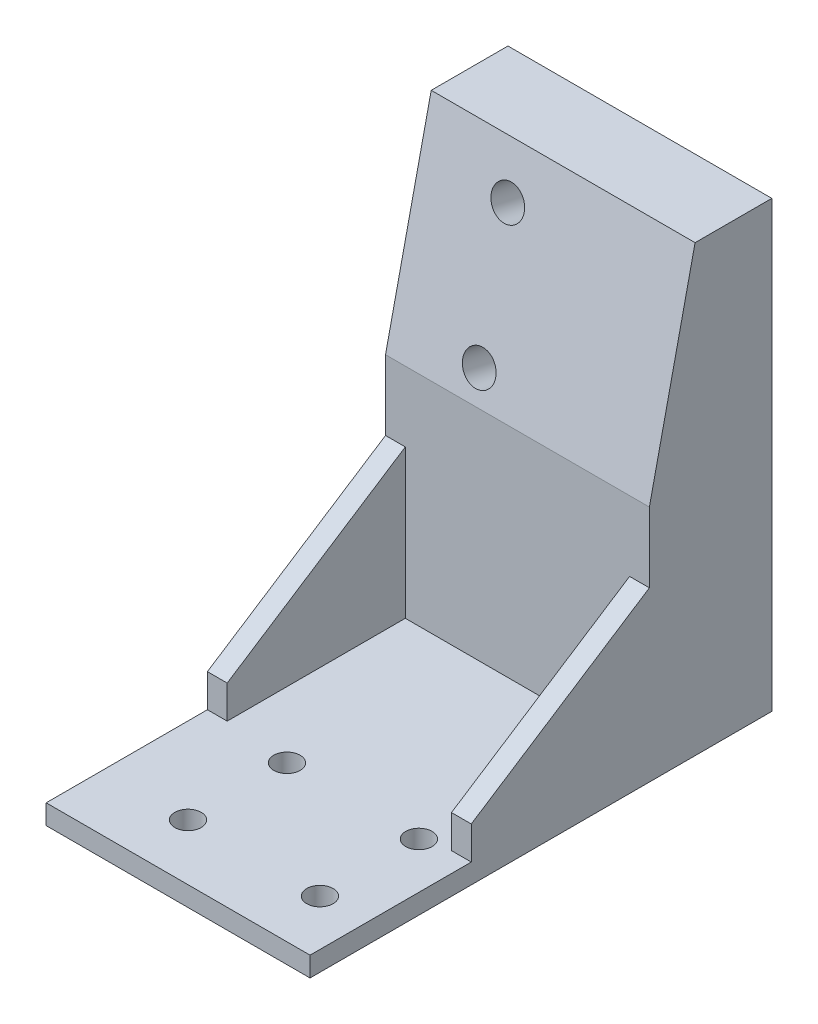
ISO-10303-21;
HEADER;
FILE_DESCRIPTION(('STEP AP214'),'2;1');
FILE_NAME('part.step','',(''),(''),'','','');
FILE_SCHEMA(('AUTOMOTIVE_DESIGN { 1 0 10303 214 1 1 1 1 }'));
ENDSEC;
DATA;
#1=APPLICATION_CONTEXT('core data for automotive mechanical design processes');
#2=APPLICATION_PROTOCOL_DEFINITION('international standard','automotive_design',2000,#1);
#3=PRODUCT_CONTEXT('',#1,'mechanical');
#4=PRODUCT('Part','Part','',(#3));
#5=PRODUCT_RELATED_PRODUCT_CATEGORY('part','',(#4));
#6=PRODUCT_DEFINITION_FORMATION('','',#4);
#7=PRODUCT_DEFINITION_CONTEXT('part definition',#1,'design');
#8=PRODUCT_DEFINITION('design','',#6,#7);
#9=PRODUCT_DEFINITION_SHAPE('','',#8);
#10=(LENGTH_UNIT() NAMED_UNIT(*) SI_UNIT(.MILLI.,.METRE.));
#11=(NAMED_UNIT(*) PLANE_ANGLE_UNIT() SI_UNIT($,.RADIAN.));
#12=(NAMED_UNIT(*) SI_UNIT($,.STERADIAN.) SOLID_ANGLE_UNIT());
#13=UNCERTAINTY_MEASURE_WITH_UNIT(LENGTH_MEASURE(1.E-05),#10,'distance_accuracy_value','');
#14=(GEOMETRIC_REPRESENTATION_CONTEXT(3) GLOBAL_UNCERTAINTY_ASSIGNED_CONTEXT((#13)) GLOBAL_UNIT_ASSIGNED_CONTEXT((#10,
#11,#12)) REPRESENTATION_CONTEXT('',''));
#15=CARTESIAN_POINT('',(0.,0.,0.));
#16=DIRECTION('',(0.,0.,1.));
#17=DIRECTION('',(1.,0.,0.));
#18=AXIS2_PLACEMENT_3D('',#15,#16,#17);
#19=CARTESIAN_POINT('',(0.,3.,0.));
#20=DIRECTION('',(0.,-1.,0.));
#21=DIRECTION('',(0.,0.,-1.));
#22=AXIS2_PLACEMENT_3D('',#19,#20,#21);
#23=PLANE('',#22);
#24=CARTESIAN_POINT('',(-7.,3.,11.5));
#25=DIRECTION('',(0.,1.,0.));
#26=DIRECTION('',(0.,0.,1.));
#27=AXIS2_PLACEMENT_3D('',#24,#25,#26);
#28=CIRCLE('',#27,2.);
#29=CARTESIAN_POINT('',(-7.,3.,13.5));
#30=VERTEX_POINT('',#29);
#31=EDGE_CURVE('E237',#30,#30,#28,.T.);
#32=ORIENTED_EDGE('',*,*,#31,.F.);
#33=EDGE_LOOP('',(#32));
#34=FACE_BOUND('',#33,.T.);
#35=CARTESIAN_POINT('',(13.,3.,26.5));
#36=DIRECTION('',(0.,1.,0.));
#37=DIRECTION('',(0.,0.,1.));
#38=AXIS2_PLACEMENT_3D('',#35,#36,#37);
#39=CIRCLE('',#38,2.);
#40=CARTESIAN_POINT('',(13.,3.,28.5));
#41=VERTEX_POINT('',#40);
#42=EDGE_CURVE('E230',#41,#41,#39,.T.);
#43=ORIENTED_EDGE('',*,*,#42,.F.);
#44=EDGE_LOOP('',(#43));
#45=FACE_BOUND('',#44,.T.);
#46=CARTESIAN_POINT('',(-7.,3.,26.5));
#47=DIRECTION('',(0.,1.,0.));
#48=DIRECTION('',(0.,0.,1.));
#49=AXIS2_PLACEMENT_3D('',#46,#47,#48);
#50=CIRCLE('',#49,2.);
#51=CARTESIAN_POINT('',(-7.,3.,28.5));
#52=VERTEX_POINT('',#51);
#53=EDGE_CURVE('E238',#52,#52,#50,.T.);
#54=ORIENTED_EDGE('',*,*,#53,.F.);
#55=EDGE_LOOP('',(#54));
#56=FACE_BOUND('',#55,.T.);
#57=CARTESIAN_POINT('',(13.,3.,11.5));
#58=DIRECTION('',(0.,1.,0.));
#59=DIRECTION('',(0.,0.,1.));
#60=AXIS2_PLACEMENT_3D('',#57,#58,#59);
#61=CIRCLE('',#60,2.);
#62=CARTESIAN_POINT('',(13.,3.,13.5));
#63=VERTEX_POINT('',#62);
#64=EDGE_CURVE('E232',#63,#63,#61,.T.);
#65=ORIENTED_EDGE('',*,*,#64,.F.);
#66=EDGE_LOOP('',(#65));
#67=FACE_BOUND('',#66,.T.);
#68=DIRECTION('',(0.,0.,-1.));
#69=VECTOR('',#68,1.);
#70=CARTESIAN_POINT('',(-17.,3.,10.56));
#71=LINE('',#70,#69);
#72=CARTESIAN_POINT('',(-17.,3.,10.56));
#73=VERTEX_POINT('',#72);
#74=CARTESIAN_POINT('',(-17.,3.,-16.44));
#75=VERTEX_POINT('',#74);
#76=EDGE_CURVE('E57',#73,#75,#71,.T.);
#77=ORIENTED_EDGE('',*,*,#76,.F.);
#78=DIRECTION('',(-1.,0.,0.));
#79=VECTOR('',#78,1.);
#80=CARTESIAN_POINT('',(-17.,3.,10.56));
#81=LINE('',#80,#79);
#82=CARTESIAN_POINT('',(-20.,3.,10.56));
#83=VERTEX_POINT('',#82);
#84=EDGE_CURVE('E141',#73,#83,#81,.T.);
#85=ORIENTED_EDGE('',*,*,#84,.T.);
#86=DIRECTION('',(0.,0.,1.));
#87=VECTOR('',#86,1.);
#88=CARTESIAN_POINT('',(-20.,3.,35.));
#89=LINE('',#88,#87);
#90=CARTESIAN_POINT('',(-20.,3.,35.));
#91=VERTEX_POINT('',#90);
#92=EDGE_CURVE('E255',#83,#91,#89,.T.);
#93=ORIENTED_EDGE('',*,*,#92,.T.);
#94=DIRECTION('',(1.,0.,0.));
#95=VECTOR('',#94,1.);
#96=CARTESIAN_POINT('',(-20.,3.,35.));
#97=LINE('',#96,#95);
#98=CARTESIAN_POINT('',(20.,3.,35.));
#99=VERTEX_POINT('',#98);
#100=EDGE_CURVE('E260',#91,#99,#97,.T.);
#101=ORIENTED_EDGE('',*,*,#100,.T.);
#102=DIRECTION('',(0.,0.,-1.));
#103=VECTOR('',#102,1.);
#104=CARTESIAN_POINT('',(20.,3.,35.));
#105=LINE('',#104,#103);
#106=CARTESIAN_POINT('',(20.,3.,10.56));
#107=VERTEX_POINT('',#106);
#108=EDGE_CURVE('E253',#99,#107,#105,.T.);
#109=ORIENTED_EDGE('',*,*,#108,.T.);
#110=DIRECTION('',(1.,0.,0.));
#111=VECTOR('',#110,1.);
#112=CARTESIAN_POINT('',(17.,3.,10.56));
#113=LINE('',#112,#111);
#114=CARTESIAN_POINT('',(17.,3.,10.56));
#115=VERTEX_POINT('',#114);
#116=EDGE_CURVE('E181',#115,#107,#113,.T.);
#117=ORIENTED_EDGE('',*,*,#116,.F.);
#118=DIRECTION('',(0.,0.,-1.));
#119=VECTOR('',#118,1.);
#120=CARTESIAN_POINT('',(17.,3.,10.56));
#121=LINE('',#120,#119);
#122=CARTESIAN_POINT('',(17.,3.,-16.44));
#123=VERTEX_POINT('',#122);
#124=EDGE_CURVE('E172',#115,#123,#121,.T.);
#125=ORIENTED_EDGE('',*,*,#124,.T.);
#126=DIRECTION('',(1.,0.,0.));
#127=VECTOR('',#126,1.);
#128=CARTESIAN_POINT('',(-86.9745143908501,3.,-16.44));
#129=LINE('',#128,#127);
#130=EDGE_CURVE('E206',#75,#123,#129,.T.);
#131=ORIENTED_EDGE('',*,*,#130,.F.);
#132=EDGE_LOOP('',(#77,#85,#93,#101,#109,#117,#125,#131));
#133=FACE_BOUND('',#132,.T.);
#134=ADVANCED_FACE('F41',(#34,#45,#56,#67,#133),#23,.F.);
#135=CARTESIAN_POINT('',(-86.9745143908501,3.,-16.44));
#136=DIRECTION('',(0.,0.,1.));
#137=DIRECTION('',(1.,0.,0.));
#138=AXIS2_PLACEMENT_3D('',#135,#136,#137);
#139=PLANE('',#138);
#140=DIRECTION('',(-1.,0.,0.));
#141=VECTOR('',#140,1.);
#142=CARTESIAN_POINT('',(-17.,25.5,-16.44));
#143=LINE('',#142,#141);
#144=CARTESIAN_POINT('',(-17.,25.5,-16.44));
#145=VERTEX_POINT('',#144);
#146=CARTESIAN_POINT('',(-20.,25.5,-16.44));
#147=VERTEX_POINT('',#146);
#148=EDGE_CURVE('E153',#145,#147,#143,.T.);
#149=ORIENTED_EDGE('',*,*,#148,.F.);
#150=DIRECTION('',(0.,1.,0.));
#151=VECTOR('',#150,1.);
#152=CARTESIAN_POINT('',(-17.,3.,-16.44));
#153=LINE('',#152,#151);
#154=EDGE_CURVE('E64',#75,#145,#153,.T.);
#155=ORIENTED_EDGE('',*,*,#154,.F.);
#156=ORIENTED_EDGE('',*,*,#130,.T.);
#157=DIRECTION('',(0.,1.,0.));
#158=VECTOR('',#157,1.);
#159=CARTESIAN_POINT('',(17.,3.,-16.44));
#160=LINE('',#159,#158);
#161=CARTESIAN_POINT('',(17.,25.5,-16.44));
#162=VERTEX_POINT('',#161);
#163=EDGE_CURVE('E167',#123,#162,#160,.T.);
#164=ORIENTED_EDGE('',*,*,#163,.T.);
#165=DIRECTION('',(1.,0.,0.));
#166=VECTOR('',#165,1.);
#167=CARTESIAN_POINT('',(17.,25.5,-16.44));
#168=LINE('',#167,#166);
#169=CARTESIAN_POINT('',(20.,25.5,-16.44));
#170=VERTEX_POINT('',#169);
#171=EDGE_CURVE('E177',#162,#170,#168,.T.);
#172=ORIENTED_EDGE('',*,*,#171,.T.);
#173=DIRECTION('',(0.,-1.,0.));
#174=VECTOR('',#173,1.);
#175=CARTESIAN_POINT('',(20.,3.,-16.44));
#176=LINE('',#175,#174);
#177=CARTESIAN_POINT('',(20.,36.11,-16.44));
#178=VERTEX_POINT('',#177);
#179=EDGE_CURVE('E216',#178,#170,#176,.T.);
#180=ORIENTED_EDGE('',*,*,#179,.F.);
#181=DIRECTION('',(1.,0.,0.));
#182=VECTOR('',#181,1.);
#183=CARTESIAN_POINT('',(-86.9745143908501,36.11,-16.44));
#184=LINE('',#183,#182);
#185=CARTESIAN_POINT('',(-20.,36.11,-16.44));
#186=VERTEX_POINT('',#185);
#187=EDGE_CURVE('E222',#186,#178,#184,.T.);
#188=ORIENTED_EDGE('',*,*,#187,.F.);
#189=DIRECTION('',(0.,1.,0.));
#190=VECTOR('',#189,1.);
#191=CARTESIAN_POINT('',(-20.,3.,-16.44));
#192=LINE('',#191,#190);
#193=EDGE_CURVE('E208',#147,#186,#192,.T.);
#194=ORIENTED_EDGE('',*,*,#193,.F.);
#195=EDGE_LOOP('',(#149,#155,#156,#164,#172,#180,#188,#194));
#196=FACE_BOUND('',#195,.T.);
#197=ADVANCED_FACE('F291',(#196),#139,.T.);
#198=CARTESIAN_POINT('',(20.,3.,35.));
#199=DIRECTION('',(-1.,0.,0.));
#200=DIRECTION('',(0.,0.,1.));
#201=AXIS2_PLACEMENT_3D('',#198,#199,#200);
#202=PLANE('',#201);
#203=DIRECTION('',(0.,0.,-1.));
#204=VECTOR('',#203,1.);
#205=CARTESIAN_POINT('',(20.,0.,35.));
#206=LINE('',#205,#204);
#207=CARTESIAN_POINT('',(20.,0.,35.));
#208=VERTEX_POINT('',#207);
#209=CARTESIAN_POINT('',(20.,0.,-35.));
#210=VERTEX_POINT('',#209);
#211=EDGE_CURVE('E247',#208,#210,#206,.T.);
#212=ORIENTED_EDGE('',*,*,#211,.T.);
#213=DIRECTION('',(0.,-1.,0.));
#214=VECTOR('',#213,1.);
#215=CARTESIAN_POINT('',(20.,3.,-35.));
#216=LINE('',#215,#214);
#217=CARTESIAN_POINT('',(20.,67.3514722278379,-35.));
#218=VERTEX_POINT('',#217);
#219=EDGE_CURVE('E11',#218,#210,#216,.T.);
#220=ORIENTED_EDGE('',*,*,#219,.F.);
#221=DIRECTION('',(0.,0.,1.));
#222=VECTOR('',#221,1.);
#223=CARTESIAN_POINT('',(20.,67.3514722278379,-23.3660676460193));
#224=LINE('',#223,#222);
#225=CARTESIAN_POINT('',(20.,67.3514722278379,-23.3660676460193));
#226=VERTEX_POINT('',#225);
#227=EDGE_CURVE('E203',#218,#226,#224,.T.);
#228=ORIENTED_EDGE('',*,*,#227,.T.);
#229=DIRECTION('',(0.,-0.976296007119933,0.216439613938103));
#230=VECTOR('',#229,1.);
#231=CARTESIAN_POINT('',(20.,36.11,-16.44));
#232=LINE('',#231,#230);
#233=EDGE_CURVE('E213',#226,#178,#232,.T.);
#234=ORIENTED_EDGE('',*,*,#233,.T.);
#235=ORIENTED_EDGE('',*,*,#179,.T.);
#236=DIRECTION('',(0.,-0.543895454249569,0.839152986556477));
#237=VECTOR('',#236,1.);
#238=CARTESIAN_POINT('',(20.,25.5,-16.44));
#239=LINE('',#238,#237);
#240=CARTESIAN_POINT('',(20.,8.,10.56));
#241=VERTEX_POINT('',#240);
#242=EDGE_CURVE('E162',#170,#241,#239,.T.);
#243=ORIENTED_EDGE('',*,*,#242,.T.);
#244=DIRECTION('',(0.,-1.,0.));
#245=VECTOR('',#244,1.);
#246=CARTESIAN_POINT('',(20.,8.,10.56));
#247=LINE('',#246,#245);
#248=EDGE_CURVE('E168',#241,#107,#247,.T.);
#249=ORIENTED_EDGE('',*,*,#248,.T.);
#250=ORIENTED_EDGE('',*,*,#108,.F.);
#251=DIRECTION('',(0.,-1.,0.));
#252=VECTOR('',#251,1.);
#253=CARTESIAN_POINT('',(20.,3.,35.));
#254=LINE('',#253,#252);
#255=EDGE_CURVE('E259',#99,#208,#254,.T.);
#256=ORIENTED_EDGE('',*,*,#255,.T.);
#257=EDGE_LOOP('',(#212,#220,#228,#234,#235,#243,#249,#250,#256));
#258=FACE_BOUND('',#257,.T.);
#259=ADVANCED_FACE('F43',(#258),#202,.F.);
#260=CARTESIAN_POINT('',(-20.,3.,-35.));
#261=DIRECTION('',(0.,0.,1.));
#262=DIRECTION('',(1.,0.,0.));
#263=AXIS2_PLACEMENT_3D('',#260,#261,#262);
#264=PLANE('',#263);
#265=CARTESIAN_POINT('',(-6.77,57.0901951620525,-35.));
#266=DIRECTION('',(0.,0.,1.));
#267=DIRECTION('',(0.,1.,0.));
#268=AXIS2_PLACEMENT_3D('',#265,#266,#267);
#269=ELLIPSE('',#268,2.56069878578627,2.5);
#270=CARTESIAN_POINT('',(-6.77,59.6508939478388,-35.));
#271=VERTEX_POINT('',#270);
#272=EDGE_CURVE('E196',#271,#271,#269,.T.);
#273=ORIENTED_EDGE('',*,*,#272,.T.);
#274=EDGE_LOOP('',(#273));
#275=FACE_BOUND('',#274,.T.);
#276=CARTESIAN_POINT('',(-6.77,36.6046048757623,-35.));
#277=DIRECTION('',(0.,0.,1.));
#278=DIRECTION('',(0.,1.,0.));
#279=AXIS2_PLACEMENT_3D('',#276,#277,#278);
#280=ELLIPSE('',#279,2.56069878578627,2.5);
#281=CARTESIAN_POINT('',(-6.77,39.1653036615486,-35.));
#282=VERTEX_POINT('',#281);
#283=EDGE_CURVE('E192',#282,#282,#280,.T.);
#284=ORIENTED_EDGE('',*,*,#283,.T.);
#285=EDGE_LOOP('',(#284));
#286=FACE_BOUND('',#285,.T.);
#287=DIRECTION('',(-1.,0.,0.));
#288=VECTOR('',#287,1.);
#289=CARTESIAN_POINT('',(-20.,0.,-35.));
#290=LINE('',#289,#288);
#291=CARTESIAN_POINT('',(-20.,0.,-35.));
#292=VERTEX_POINT('',#291);
#293=EDGE_CURVE('E265',#210,#292,#290,.T.);
#294=ORIENTED_EDGE('',*,*,#293,.T.);
#295=DIRECTION('',(0.,-1.,0.));
#296=VECTOR('',#295,1.);
#297=CARTESIAN_POINT('',(-20.,3.,-35.));
#298=LINE('',#297,#296);
#299=CARTESIAN_POINT('',(-20.,67.3514722278379,-35.));
#300=VERTEX_POINT('',#299);
#301=EDGE_CURVE('E47',#300,#292,#298,.T.);
#302=ORIENTED_EDGE('',*,*,#301,.F.);
#303=DIRECTION('',(1.,0.,0.));
#304=VECTOR('',#303,1.);
#305=CARTESIAN_POINT('',(-86.9745143908501,67.3514722278379,-35.));
#306=LINE('',#305,#304);
#307=EDGE_CURVE('E218',#300,#218,#306,.T.);
#308=ORIENTED_EDGE('',*,*,#307,.T.);
#309=ORIENTED_EDGE('',*,*,#219,.T.);
#310=EDGE_LOOP('',(#294,#302,#308,#309));
#311=FACE_BOUND('',#310,.T.);
#312=ADVANCED_FACE('F302',(#275,#286,#311),#264,.F.);
#313=CARTESIAN_POINT('',(-20.,3.,35.));
#314=DIRECTION('',(1.,0.,0.));
#315=DIRECTION('',(0.,0.,-1.));
#316=AXIS2_PLACEMENT_3D('',#313,#314,#315);
#317=PLANE('',#316);
#318=ORIENTED_EDGE('',*,*,#92,.F.);
#319=DIRECTION('',(0.,-1.,0.));
#320=VECTOR('',#319,1.);
#321=CARTESIAN_POINT('',(-20.,8.,10.56));
#322=LINE('',#321,#320);
#323=CARTESIAN_POINT('',(-20.,8.,10.56));
#324=VERTEX_POINT('',#323);
#325=EDGE_CURVE('E159',#324,#83,#322,.T.);
#326=ORIENTED_EDGE('',*,*,#325,.F.);
#327=DIRECTION('',(0.,-0.543895454249569,0.839152986556477));
#328=VECTOR('',#327,1.);
#329=CARTESIAN_POINT('',(-20.,25.5,-16.44));
#330=LINE('',#329,#328);
#331=EDGE_CURVE('E149',#147,#324,#330,.T.);
#332=ORIENTED_EDGE('',*,*,#331,.F.);
#333=ORIENTED_EDGE('',*,*,#193,.T.);
#334=DIRECTION('',(0.,0.976296007119933,-0.216439613938103));
#335=VECTOR('',#334,1.);
#336=CARTESIAN_POINT('',(-20.,36.11,-16.44));
#337=LINE('',#336,#335);
#338=CARTESIAN_POINT('',(-20.,67.3514722278379,-23.3660676460193));
#339=VERTEX_POINT('',#338);
#340=EDGE_CURVE('E202',#186,#339,#337,.T.);
#341=ORIENTED_EDGE('',*,*,#340,.T.);
#342=DIRECTION('',(0.,0.,-1.));
#343=VECTOR('',#342,1.);
#344=CARTESIAN_POINT('',(-20.,67.3514722278379,-23.3660676460193));
#345=LINE('',#344,#343);
#346=EDGE_CURVE('E205',#339,#300,#345,.T.);
#347=ORIENTED_EDGE('',*,*,#346,.T.);
#348=ORIENTED_EDGE('',*,*,#301,.T.);
#349=DIRECTION('',(0.,0.,1.));
#350=VECTOR('',#349,1.);
#351=CARTESIAN_POINT('',(-20.,0.,35.));
#352=LINE('',#351,#350);
#353=CARTESIAN_POINT('',(-20.,0.,35.));
#354=VERTEX_POINT('',#353);
#355=EDGE_CURVE('E262',#292,#354,#352,.T.);
#356=ORIENTED_EDGE('',*,*,#355,.T.);
#357=DIRECTION('',(0.,-1.,0.));
#358=VECTOR('',#357,1.);
#359=CARTESIAN_POINT('',(-20.,3.,35.));
#360=LINE('',#359,#358);
#361=EDGE_CURVE('E267',#91,#354,#360,.T.);
#362=ORIENTED_EDGE('',*,*,#361,.F.);
#363=EDGE_LOOP('',(#318,#326,#332,#333,#341,#347,#348,#356,#362));
#364=FACE_BOUND('',#363,.T.);
#365=ADVANCED_FACE('F274',(#364),#317,.F.);
#366=CARTESIAN_POINT('',(-20.,3.,35.));
#367=DIRECTION('',(0.,0.,-1.));
#368=DIRECTION('',(-1.,0.,0.));
#369=AXIS2_PLACEMENT_3D('',#366,#367,#368);
#370=PLANE('',#369);
#371=DIRECTION('',(1.,0.,0.));
#372=VECTOR('',#371,1.);
#373=CARTESIAN_POINT('',(-20.,0.,35.));
#374=LINE('',#373,#372);
#375=EDGE_CURVE('E254',#354,#208,#374,.T.);
#376=ORIENTED_EDGE('',*,*,#375,.T.);
#377=ORIENTED_EDGE('',*,*,#255,.F.);
#378=ORIENTED_EDGE('',*,*,#100,.F.);
#379=ORIENTED_EDGE('',*,*,#361,.T.);
#380=EDGE_LOOP('',(#376,#377,#378,#379));
#381=FACE_BOUND('',#380,.T.);
#382=ADVANCED_FACE('F288',(#381),#370,.F.);
#383=CARTESIAN_POINT('',(0.,0.,0.));
#384=DIRECTION('',(0.,-1.,0.));
#385=DIRECTION('',(0.,0.,-1.));
#386=AXIS2_PLACEMENT_3D('',#383,#384,#385);
#387=PLANE('',#386);
#388=CARTESIAN_POINT('',(13.,0.,11.5));
#389=DIRECTION('',(0.,1.,0.));
#390=DIRECTION('',(0.,0.,1.));
#391=AXIS2_PLACEMENT_3D('',#388,#389,#390);
#392=CIRCLE('',#391,2.);
#393=CARTESIAN_POINT('',(13.,0.,13.5));
#394=VERTEX_POINT('',#393);
#395=EDGE_CURVE('E240',#394,#394,#392,.T.);
#396=ORIENTED_EDGE('',*,*,#395,.T.);
#397=EDGE_LOOP('',(#396));
#398=FACE_BOUND('',#397,.T.);
#399=CARTESIAN_POINT('',(-7.,0.,26.5));
#400=DIRECTION('',(0.,1.,0.));
#401=DIRECTION('',(0.,0.,1.));
#402=AXIS2_PLACEMENT_3D('',#399,#400,#401);
#403=CIRCLE('',#402,2.);
#404=CARTESIAN_POINT('',(-7.,0.,28.5));
#405=VERTEX_POINT('',#404);
#406=EDGE_CURVE('E227',#405,#405,#403,.T.);
#407=ORIENTED_EDGE('',*,*,#406,.T.);
#408=EDGE_LOOP('',(#407));
#409=FACE_BOUND('',#408,.T.);
#410=CARTESIAN_POINT('',(13.,0.,26.5));
#411=DIRECTION('',(0.,1.,0.));
#412=DIRECTION('',(0.,0.,1.));
#413=AXIS2_PLACEMENT_3D('',#410,#411,#412);
#414=CIRCLE('',#413,2.);
#415=CARTESIAN_POINT('',(13.,0.,28.5));
#416=VERTEX_POINT('',#415);
#417=EDGE_CURVE('E209',#416,#416,#414,.T.);
#418=ORIENTED_EDGE('',*,*,#417,.T.);
#419=EDGE_LOOP('',(#418));
#420=FACE_BOUND('',#419,.T.);
#421=CARTESIAN_POINT('',(-7.,0.,11.5));
#422=DIRECTION('',(0.,1.,0.));
#423=DIRECTION('',(0.,0.,1.));
#424=AXIS2_PLACEMENT_3D('',#421,#422,#423);
#425=CIRCLE('',#424,2.);
#426=CARTESIAN_POINT('',(-7.,0.,13.5));
#427=VERTEX_POINT('',#426);
#428=EDGE_CURVE('E242',#427,#427,#425,.T.);
#429=ORIENTED_EDGE('',*,*,#428,.T.);
#430=EDGE_LOOP('',(#429));
#431=FACE_BOUND('',#430,.T.);
#432=ORIENTED_EDGE('',*,*,#211,.F.);
#433=ORIENTED_EDGE('',*,*,#375,.F.);
#434=ORIENTED_EDGE('',*,*,#355,.F.);
#435=ORIENTED_EDGE('',*,*,#293,.F.);
#436=EDGE_LOOP('',(#432,#433,#434,#435));
#437=FACE_BOUND('',#436,.T.);
#438=ADVANCED_FACE('F281',(#398,#409,#420,#431,#437),#387,.T.);
#439=CARTESIAN_POINT('',(-7.,0.,11.5));
#440=DIRECTION('',(0.,1.,0.));
#441=DIRECTION('',(0.,0.,1.));
#442=AXIS2_PLACEMENT_3D('',#439,#440,#441);
#443=CYLINDRICAL_SURFACE('',#442,2.);
#444=ORIENTED_EDGE('',*,*,#428,.F.);
#445=EDGE_LOOP('',(#444));
#446=FACE_BOUND('',#445,.T.);
#447=ORIENTED_EDGE('',*,*,#31,.T.);
#448=EDGE_LOOP('',(#447));
#449=FACE_BOUND('',#448,.T.);
#450=ADVANCED_FACE('F326',(#446,#449),#443,.F.);
#451=CARTESIAN_POINT('',(13.,0.,26.5));
#452=DIRECTION('',(0.,1.,0.));
#453=DIRECTION('',(0.,0.,1.));
#454=AXIS2_PLACEMENT_3D('',#451,#452,#453);
#455=CYLINDRICAL_SURFACE('',#454,2.);
#456=ORIENTED_EDGE('',*,*,#417,.F.);
#457=EDGE_LOOP('',(#456));
#458=FACE_BOUND('',#457,.T.);
#459=ORIENTED_EDGE('',*,*,#42,.T.);
#460=EDGE_LOOP('',(#459));
#461=FACE_BOUND('',#460,.T.);
#462=ADVANCED_FACE('F350',(#458,#461),#455,.F.);
#463=CARTESIAN_POINT('',(-7.,0.,26.5));
#464=DIRECTION('',(0.,1.,0.));
#465=DIRECTION('',(0.,0.,1.));
#466=AXIS2_PLACEMENT_3D('',#463,#464,#465);
#467=CYLINDRICAL_SURFACE('',#466,2.);
#468=ORIENTED_EDGE('',*,*,#406,.F.);
#469=EDGE_LOOP('',(#468));
#470=FACE_BOUND('',#469,.T.);
#471=ORIENTED_EDGE('',*,*,#53,.T.);
#472=EDGE_LOOP('',(#471));
#473=FACE_BOUND('',#472,.T.);
#474=ADVANCED_FACE('F352',(#470,#473),#467,.F.);
#475=CARTESIAN_POINT('',(13.,0.,11.5));
#476=DIRECTION('',(0.,1.,0.));
#477=DIRECTION('',(0.,0.,1.));
#478=AXIS2_PLACEMENT_3D('',#475,#476,#477);
#479=CYLINDRICAL_SURFACE('',#478,2.);
#480=ORIENTED_EDGE('',*,*,#395,.F.);
#481=EDGE_LOOP('',(#480));
#482=FACE_BOUND('',#481,.T.);
#483=ORIENTED_EDGE('',*,*,#64,.T.);
#484=EDGE_LOOP('',(#483));
#485=FACE_BOUND('',#484,.T.);
#486=ADVANCED_FACE('F365',(#482,#485),#479,.F.);
#487=CARTESIAN_POINT('',(-86.9745143908501,36.11,-16.44));
#488=DIRECTION('',(0.,0.216439613938103,0.976296007119933));
#489=DIRECTION('',(0.,-0.976296007119933,0.216439613938103));
#490=AXIS2_PLACEMENT_3D('',#487,#488,#489);
#491=PLANE('',#490);
#492=CARTESIAN_POINT('',(-6.77,60.0292521744384,-21.7427705414835));
#493=DIRECTION('',(0.,0.216439613938103,0.976296007119933));
#494=DIRECTION('',(0.,-0.976296007119933,0.216439613938103));
#495=AXIS2_PLACEMENT_3D('',#492,#493,#494);
#496=CIRCLE('',#495,2.5);
#497=CARTESIAN_POINT('',(-6.77,57.5885121566385,-21.2016715066383));
#498=VERTEX_POINT('',#497);
#499=EDGE_CURVE('E187',#498,#498,#496,.T.);
#500=ORIENTED_EDGE('',*,*,#499,.F.);
#501=EDGE_LOOP('',(#500));
#502=FACE_BOUND('',#501,.T.);
#503=CARTESIAN_POINT('',(-6.77,40.5033320320397,-17.4139782627215));
#504=DIRECTION('',(0.,0.216439613938103,0.976296007119933));
#505=DIRECTION('',(0.,-0.976296007119933,0.216439613938103));
#506=AXIS2_PLACEMENT_3D('',#503,#504,#505);
#507=CIRCLE('',#506,2.5);
#508=CARTESIAN_POINT('',(-6.77,38.0625920142399,-16.8728792278762));
#509=VERTEX_POINT('',#508);
#510=EDGE_CURVE('E183',#509,#509,#507,.T.);
#511=ORIENTED_EDGE('',*,*,#510,.F.);
#512=EDGE_LOOP('',(#511));
#513=FACE_BOUND('',#512,.T.);
#514=ORIENTED_EDGE('',*,*,#340,.F.);
#515=ORIENTED_EDGE('',*,*,#187,.T.);
#516=ORIENTED_EDGE('',*,*,#233,.F.);
#517=DIRECTION('',(1.,0.,0.));
#518=VECTOR('',#517,1.);
#519=CARTESIAN_POINT('',(-86.9745143908501,67.3514722278379,-23.3660676460193));
#520=LINE('',#519,#518);
#521=EDGE_CURVE('E224',#339,#226,#520,.T.);
#522=ORIENTED_EDGE('',*,*,#521,.F.);
#523=EDGE_LOOP('',(#514,#515,#516,#522));
#524=FACE_BOUND('',#523,.T.);
#525=ADVANCED_FACE('F296',(#502,#513,#524),#491,.T.);
#526=CARTESIAN_POINT('',(-86.9745143908501,67.3514722278379,-23.3660676460193));
#527=DIRECTION('',(0.,1.,0.));
#528=DIRECTION('',(0.,0.,1.));
#529=AXIS2_PLACEMENT_3D('',#526,#527,#528);
#530=PLANE('',#529);
#531=ORIENTED_EDGE('',*,*,#346,.F.);
#532=ORIENTED_EDGE('',*,*,#521,.T.);
#533=ORIENTED_EDGE('',*,*,#227,.F.);
#534=ORIENTED_EDGE('',*,*,#307,.F.);
#535=EDGE_LOOP('',(#531,#532,#533,#534));
#536=FACE_BOUND('',#535,.T.);
#537=ADVANCED_FACE('F304',(#536),#530,.T.);
#538=CARTESIAN_POINT('',(-6.77,34.8898216580327,-42.7348872421499));
#539=DIRECTION('',(0.,0.216439613938103,0.976296007119933));
#540=DIRECTION('',(0.,-0.976296007119933,0.216439613938103));
#541=AXIS2_PLACEMENT_3D('',#538,#539,#540);
#542=CYLINDRICAL_SURFACE('',#541,2.5);
#543=ORIENTED_EDGE('',*,*,#510,.T.);
#544=EDGE_LOOP('',(#543));
#545=FACE_BOUND('',#544,.T.);
#546=ORIENTED_EDGE('',*,*,#283,.F.);
#547=EDGE_LOOP('',(#546));
#548=FACE_BOUND('',#547,.T.);
#549=ADVANCED_FACE('F377',(#545,#548),#542,.F.);
#550=CARTESIAN_POINT('',(-6.77,54.4157418004314,-47.063679520912));
#551=DIRECTION('',(0.,0.216439613938103,0.976296007119933));
#552=DIRECTION('',(0.,-0.976296007119933,0.216439613938103));
#553=AXIS2_PLACEMENT_3D('',#550,#551,#552);
#554=CYLINDRICAL_SURFACE('',#553,2.5);
#555=ORIENTED_EDGE('',*,*,#499,.T.);
#556=EDGE_LOOP('',(#555));
#557=FACE_BOUND('',#556,.T.);
#558=ORIENTED_EDGE('',*,*,#272,.F.);
#559=EDGE_LOOP('',(#558));
#560=FACE_BOUND('',#559,.T.);
#561=ADVANCED_FACE('F398',(#557,#560),#554,.F.);
#562=CARTESIAN_POINT('',(17.,8.,10.56));
#563=DIRECTION('',(0.,0.,1.));
#564=DIRECTION('',(0.,-1.,0.));
#565=AXIS2_PLACEMENT_3D('',#562,#563,#564);
#566=PLANE('',#565);
#567=ORIENTED_EDGE('',*,*,#248,.F.);
#568=DIRECTION('',(1.,0.,0.));
#569=VECTOR('',#568,1.);
#570=CARTESIAN_POINT('',(17.,8.,10.56));
#571=LINE('',#570,#569);
#572=CARTESIAN_POINT('',(17.,8.,10.56));
#573=VERTEX_POINT('',#572);
#574=EDGE_CURVE('E188',#573,#241,#571,.T.);
#575=ORIENTED_EDGE('',*,*,#574,.F.);
#576=DIRECTION('',(0.,-1.,0.));
#577=VECTOR('',#576,1.);
#578=CARTESIAN_POINT('',(17.,8.,10.56));
#579=LINE('',#578,#577);
#580=EDGE_CURVE('E171',#573,#115,#579,.T.);
#581=ORIENTED_EDGE('',*,*,#580,.T.);
#582=ORIENTED_EDGE('',*,*,#116,.T.);
#583=EDGE_LOOP('',(#567,#575,#581,#582));
#584=FACE_BOUND('',#583,.T.);
#585=ADVANCED_FACE('F408',(#584),#566,.T.);
#586=CARTESIAN_POINT('',(17.,25.5,-16.44));
#587=DIRECTION('',(0.,0.839152986556477,0.543895454249569));
#588=DIRECTION('',(0.,-0.543895454249569,0.839152986556477));
#589=AXIS2_PLACEMENT_3D('',#586,#587,#588);
#590=PLANE('',#589);
#591=ORIENTED_EDGE('',*,*,#242,.F.);
#592=ORIENTED_EDGE('',*,*,#171,.F.);
#593=DIRECTION('',(0.,-0.543895454249569,0.839152986556477));
#594=VECTOR('',#593,1.);
#595=CARTESIAN_POINT('',(17.,25.5,-16.44));
#596=LINE('',#595,#594);
#597=EDGE_CURVE('E166',#162,#573,#596,.T.);
#598=ORIENTED_EDGE('',*,*,#597,.T.);
#599=ORIENTED_EDGE('',*,*,#574,.T.);
#600=EDGE_LOOP('',(#591,#592,#598,#599));
#601=FACE_BOUND('',#600,.T.);
#602=ADVANCED_FACE('F428',(#601),#590,.T.);
#603=CARTESIAN_POINT('',(17.,0.,0.));
#604=DIRECTION('',(-1.,0.,0.));
#605=DIRECTION('',(0.,0.,1.));
#606=AXIS2_PLACEMENT_3D('',#603,#604,#605);
#607=PLANE('',#606);
#608=ORIENTED_EDGE('',*,*,#163,.F.);
#609=ORIENTED_EDGE('',*,*,#124,.F.);
#610=ORIENTED_EDGE('',*,*,#580,.F.);
#611=ORIENTED_EDGE('',*,*,#597,.F.);
#612=EDGE_LOOP('',(#608,#609,#610,#611));
#613=FACE_BOUND('',#612,.T.);
#614=ADVANCED_FACE('F437',(#613),#607,.T.);
#615=CARTESIAN_POINT('',(-17.,25.5,-16.44));
#616=DIRECTION('',(0.,-0.839152986556477,-0.543895454249569));
#617=DIRECTION('',(0.,0.543895454249569,-0.839152986556477));
#618=AXIS2_PLACEMENT_3D('',#615,#616,#617);
#619=PLANE('',#618);
#620=ORIENTED_EDGE('',*,*,#331,.T.);
#621=DIRECTION('',(-1.,0.,0.));
#622=VECTOR('',#621,1.);
#623=CARTESIAN_POINT('',(-17.,8.,10.56));
#624=LINE('',#623,#622);
#625=CARTESIAN_POINT('',(-17.,8.,10.56));
#626=VERTEX_POINT('',#625);
#627=EDGE_CURVE('E148',#626,#324,#624,.T.);
#628=ORIENTED_EDGE('',*,*,#627,.F.);
#629=DIRECTION('',(0.,-0.543895454249569,0.839152986556477));
#630=VECTOR('',#629,1.);
#631=CARTESIAN_POINT('',(-17.,25.5,-16.44));
#632=LINE('',#631,#630);
#633=EDGE_CURVE('E132',#145,#626,#632,.T.);
#634=ORIENTED_EDGE('',*,*,#633,.F.);
#635=ORIENTED_EDGE('',*,*,#148,.T.);
#636=EDGE_LOOP('',(#620,#628,#634,#635));
#637=FACE_BOUND('',#636,.T.);
#638=ADVANCED_FACE('F150',(#637),#619,.F.);
#639=CARTESIAN_POINT('',(-17.,8.,10.56));
#640=DIRECTION('',(0.,0.,-1.));
#641=DIRECTION('',(0.,1.,0.));
#642=AXIS2_PLACEMENT_3D('',#639,#640,#641);
#643=PLANE('',#642);
#644=ORIENTED_EDGE('',*,*,#325,.T.);
#645=ORIENTED_EDGE('',*,*,#84,.F.);
#646=DIRECTION('',(0.,-1.,0.));
#647=VECTOR('',#646,1.);
#648=CARTESIAN_POINT('',(-17.,8.,10.56));
#649=LINE('',#648,#647);
#650=EDGE_CURVE('E140',#626,#73,#649,.T.);
#651=ORIENTED_EDGE('',*,*,#650,.F.);
#652=ORIENTED_EDGE('',*,*,#627,.T.);
#653=EDGE_LOOP('',(#644,#645,#651,#652));
#654=FACE_BOUND('',#653,.T.);
#655=ADVANCED_FACE('F154',(#654),#643,.F.);
#656=CARTESIAN_POINT('',(-17.,0.,0.));
#657=DIRECTION('',(1.,0.,0.));
#658=DIRECTION('',(0.,0.,1.));
#659=AXIS2_PLACEMENT_3D('',#656,#657,#658);
#660=PLANE('',#659);
#661=ORIENTED_EDGE('',*,*,#154,.T.);
#662=ORIENTED_EDGE('',*,*,#633,.T.);
#663=ORIENTED_EDGE('',*,*,#650,.T.);
#664=ORIENTED_EDGE('',*,*,#76,.T.);
#665=EDGE_LOOP('',(#661,#662,#663,#664));
#666=FACE_BOUND('',#665,.T.);
#667=ADVANCED_FACE('F139',(#666),#660,.T.);
#668=CLOSED_SHELL('',(#134,#197,#259,#312,#365,#382,#438,#450,#462,#474,#486,#525,#537,#549,
#561,#585,#602,#614,#638,#655,#667));
#669=MANIFOLD_SOLID_BREP('B2',#668);
#670=ADVANCED_BREP_SHAPE_REPRESENTATION('',(#18,#669),#14);
#671=SHAPE_DEFINITION_REPRESENTATION(#9,#670);
ENDSEC;
END-ISO-10303-21;
